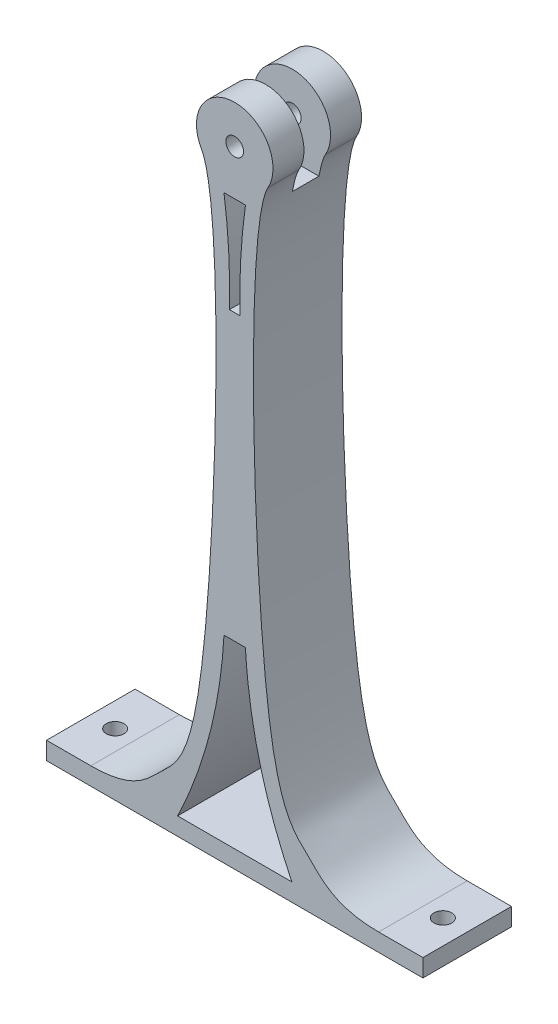
ISO-10303-21;
HEADER;
FILE_DESCRIPTION(('STEP AP214'),'2;1');
FILE_NAME('part.step','',(''),(''),'','','');
FILE_SCHEMA(('AUTOMOTIVE_DESIGN { 1 0 10303 214 1 1 1 1 }'));
ENDSEC;
DATA;
#1=APPLICATION_CONTEXT('core data for automotive mechanical design processes');
#2=APPLICATION_PROTOCOL_DEFINITION('international standard','automotive_design',2000,#1);
#3=PRODUCT_CONTEXT('',#1,'mechanical');
#4=PRODUCT('Part','Part','',(#3));
#5=PRODUCT_RELATED_PRODUCT_CATEGORY('part','',(#4));
#6=PRODUCT_DEFINITION_FORMATION('','',#4);
#7=PRODUCT_DEFINITION_CONTEXT('part definition',#1,'design');
#8=PRODUCT_DEFINITION('design','',#6,#7);
#9=PRODUCT_DEFINITION_SHAPE('','',#8);
#10=(LENGTH_UNIT() NAMED_UNIT(*) SI_UNIT(.MILLI.,.METRE.));
#11=(NAMED_UNIT(*) PLANE_ANGLE_UNIT() SI_UNIT($,.RADIAN.));
#12=(NAMED_UNIT(*) SI_UNIT($,.STERADIAN.) SOLID_ANGLE_UNIT());
#13=UNCERTAINTY_MEASURE_WITH_UNIT(LENGTH_MEASURE(1.E-05),#10,'distance_accuracy_value','');
#14=(GEOMETRIC_REPRESENTATION_CONTEXT(3) GLOBAL_UNCERTAINTY_ASSIGNED_CONTEXT((#13)) GLOBAL_UNIT_ASSIGNED_CONTEXT((#10,
#11,#12)) REPRESENTATION_CONTEXT('',''));
#15=CARTESIAN_POINT('',(0.,0.,0.));
#16=DIRECTION('',(0.,0.,1.));
#17=DIRECTION('',(1.,0.,0.));
#18=AXIS2_PLACEMENT_3D('',#15,#16,#17);
#19=CARTESIAN_POINT('',(0.,141.357798755725,20.));
#20=DIRECTION('',(0.,0.,-1.));
#21=DIRECTION('',(-1.,0.,0.));
#22=AXIS2_PLACEMENT_3D('',#19,#20,#21);
#23=CYLINDRICAL_SURFACE('',#22,8.64220124427539);
#24=CARTESIAN_POINT('',(0.,141.357798755725,7.));
#25=DIRECTION('',(0.,0.,1.));
#26=DIRECTION('',(1.,0.,0.));
#27=AXIS2_PLACEMENT_3D('',#24,#25,#26);
#28=CIRCLE('',#27,8.64220124427539);
#29=CARTESIAN_POINT('',(7.50000000000002,137.063891170953,7.));
#30=VERTEX_POINT('',#29);
#31=CARTESIAN_POINT('',(-7.50000000000002,137.063891170953,7.));
#32=VERTEX_POINT('',#31);
#33=EDGE_CURVE('E213',#30,#32,#28,.T.);
#34=ORIENTED_EDGE('',*,*,#33,.F.);
#35=DIRECTION('',(0.,0.,-1.));
#36=VECTOR('',#35,1.);
#37=CARTESIAN_POINT('',(7.5,137.063891170953,20.));
#38=LINE('',#37,#36);
#39=CARTESIAN_POINT('',(7.5,137.063891170953,0.));
#40=VERTEX_POINT('',#39);
#41=EDGE_CURVE('E198',#30,#40,#38,.T.);
#42=ORIENTED_EDGE('',*,*,#41,.T.);
#43=CARTESIAN_POINT('',(0.,141.357798755725,0.));
#44=DIRECTION('',(0.,0.,1.));
#45=DIRECTION('',(-1.,0.,0.));
#46=AXIS2_PLACEMENT_3D('',#43,#44,#45);
#47=CIRCLE('',#46,8.64220124427539);
#48=CARTESIAN_POINT('',(-7.5,137.063891170953,0.));
#49=VERTEX_POINT('',#48);
#50=EDGE_CURVE('E389',#40,#49,#47,.T.);
#51=ORIENTED_EDGE('',*,*,#50,.T.);
#52=DIRECTION('',(0.,0.,-1.));
#53=VECTOR('',#52,1.);
#54=CARTESIAN_POINT('',(-7.5,137.063891170953,20.));
#55=LINE('',#54,#53);
#56=EDGE_CURVE('E411',#32,#49,#55,.T.);
#57=ORIENTED_EDGE('',*,*,#56,.F.);
#58=EDGE_LOOP('',(#34,#42,#51,#57));
#59=FACE_BOUND('',#58,.T.);
#60=ADVANCED_FACE('F33',(#59),#23,.T.);
#61=CARTESIAN_POINT('',(0.,141.357798755725,0.));
#62=DIRECTION('',(0.,0.,1.));
#63=DIRECTION('',(1.,0.,0.));
#64=AXIS2_PLACEMENT_3D('',#61,#62,#63);
#65=CYLINDRICAL_SURFACE('',#64,2.);
#66=CARTESIAN_POINT('',(0.,141.357798755725,0.));
#67=DIRECTION('',(0.,0.,1.));
#68=DIRECTION('',(1.,0.,0.));
#69=AXIS2_PLACEMENT_3D('',#66,#67,#68);
#70=CIRCLE('',#69,2.);
#71=CARTESIAN_POINT('',(2.,141.357798755725,0.));
#72=VERTEX_POINT('',#71);
#73=EDGE_CURVE('E223',#72,#72,#70,.T.);
#74=ORIENTED_EDGE('',*,*,#73,.F.);
#75=EDGE_LOOP('',(#74));
#76=FACE_BOUND('',#75,.T.);
#77=CARTESIAN_POINT('',(0.,141.357798755725,7.));
#78=DIRECTION('',(0.,0.,1.));
#79=DIRECTION('',(1.,0.,0.));
#80=AXIS2_PLACEMENT_3D('',#77,#78,#79);
#81=CIRCLE('',#80,2.);
#82=CARTESIAN_POINT('',(2.,141.357798755725,7.));
#83=VERTEX_POINT('',#82);
#84=EDGE_CURVE('E192',#83,#83,#81,.F.);
#85=ORIENTED_EDGE('',*,*,#84,.F.);
#86=EDGE_LOOP('',(#85));
#87=FACE_BOUND('',#86,.T.);
#88=ADVANCED_FACE('F252',(#76,#87),#65,.F.);
#89=CARTESIAN_POINT('',(-42.5,0.,20.));
#90=DIRECTION('',(0.,1.,0.));
#91=DIRECTION('',(0.,0.,1.));
#92=AXIS2_PLACEMENT_3D('',#89,#90,#91);
#93=PLANE('',#92);
#94=CARTESIAN_POINT('',(37.,0.,10.));
#95=DIRECTION('',(0.,1.,0.));
#96=DIRECTION('',(0.,0.,-1.));
#97=AXIS2_PLACEMENT_3D('',#94,#95,#96);
#98=CIRCLE('',#97,2.);
#99=CARTESIAN_POINT('',(37.,0.,8.00000000000001));
#100=VERTEX_POINT('',#99);
#101=EDGE_CURVE('E465',#100,#100,#98,.T.);
#102=ORIENTED_EDGE('',*,*,#101,.T.);
#103=EDGE_LOOP('',(#102));
#104=FACE_BOUND('',#103,.T.);
#105=CARTESIAN_POINT('',(-37.,0.,10.));
#106=DIRECTION('',(0.,1.,0.));
#107=DIRECTION('',(0.,0.,1.));
#108=AXIS2_PLACEMENT_3D('',#105,#106,#107);
#109=CIRCLE('',#108,2.);
#110=CARTESIAN_POINT('',(-37.,0.,12.));
#111=VERTEX_POINT('',#110);
#112=EDGE_CURVE('E461',#111,#111,#109,.T.);
#113=ORIENTED_EDGE('',*,*,#112,.T.);
#114=EDGE_LOOP('',(#113));
#115=FACE_BOUND('',#114,.T.);
#116=DIRECTION('',(1.,0.,0.));
#117=VECTOR('',#116,1.);
#118=CARTESIAN_POINT('',(-42.5,0.,0.));
#119=LINE('',#118,#117);
#120=CARTESIAN_POINT('',(-42.5,0.,0.));
#121=VERTEX_POINT('',#120);
#122=CARTESIAN_POINT('',(42.5,0.,0.));
#123=VERTEX_POINT('',#122);
#124=EDGE_CURVE('E305',#121,#123,#119,.T.);
#125=ORIENTED_EDGE('',*,*,#124,.T.);
#126=DIRECTION('',(0.,0.,-1.));
#127=VECTOR('',#126,1.);
#128=CARTESIAN_POINT('',(42.5,0.,20.));
#129=LINE('',#128,#127);
#130=CARTESIAN_POINT('',(42.5,0.,20.));
#131=VERTEX_POINT('',#130);
#132=EDGE_CURVE('E41',#131,#123,#129,.T.);
#133=ORIENTED_EDGE('',*,*,#132,.F.);
#134=DIRECTION('',(1.,0.,0.));
#135=VECTOR('',#134,1.);
#136=CARTESIAN_POINT('',(-42.5,0.,20.));
#137=LINE('',#136,#135);
#138=CARTESIAN_POINT('',(-42.5,0.,20.));
#139=VERTEX_POINT('',#138);
#140=EDGE_CURVE('E312',#139,#131,#137,.T.);
#141=ORIENTED_EDGE('',*,*,#140,.F.);
#142=DIRECTION('',(0.,0.,-1.));
#143=VECTOR('',#142,1.);
#144=CARTESIAN_POINT('',(-42.5,0.,20.));
#145=LINE('',#144,#143);
#146=EDGE_CURVE('E377',#139,#121,#145,.T.);
#147=ORIENTED_EDGE('',*,*,#146,.T.);
#148=EDGE_LOOP('',(#125,#133,#141,#147));
#149=FACE_BOUND('',#148,.T.);
#150=ADVANCED_FACE('F35',(#104,#115,#149),#93,.F.);
#151=CARTESIAN_POINT('',(42.5,0.,20.));
#152=DIRECTION('',(-1.,0.,0.));
#153=DIRECTION('',(0.,0.,1.));
#154=AXIS2_PLACEMENT_3D('',#151,#152,#153);
#155=PLANE('',#154);
#156=DIRECTION('',(0.,1.,0.));
#157=VECTOR('',#156,1.);
#158=CARTESIAN_POINT('',(42.5,0.,0.));
#159=LINE('',#158,#157);
#160=CARTESIAN_POINT('',(42.5,4.,0.));
#161=VERTEX_POINT('',#160);
#162=EDGE_CURVE('E380',#123,#161,#159,.T.);
#163=ORIENTED_EDGE('',*,*,#162,.T.);
#164=DIRECTION('',(0.,0.,-1.));
#165=VECTOR('',#164,1.);
#166=CARTESIAN_POINT('',(42.5,4.,20.));
#167=LINE('',#166,#165);
#168=CARTESIAN_POINT('',(42.5,4.,20.));
#169=VERTEX_POINT('',#168);
#170=EDGE_CURVE('E201',#169,#161,#167,.T.);
#171=ORIENTED_EDGE('',*,*,#170,.F.);
#172=DIRECTION('',(0.,1.,0.));
#173=VECTOR('',#172,1.);
#174=CARTESIAN_POINT('',(42.5,0.,20.));
#175=LINE('',#174,#173);
#176=EDGE_CURVE('E315',#131,#169,#175,.T.);
#177=ORIENTED_EDGE('',*,*,#176,.F.);
#178=ORIENTED_EDGE('',*,*,#132,.T.);
#179=EDGE_LOOP('',(#163,#171,#177,#178));
#180=FACE_BOUND('',#179,.T.);
#181=ADVANCED_FACE('F336',(#180),#155,.F.);
#182=CARTESIAN_POINT('',(42.5,4.,20.));
#183=DIRECTION('',(0.,-1.,0.));
#184=DIRECTION('',(0.,0.,-1.));
#185=AXIS2_PLACEMENT_3D('',#182,#183,#184);
#186=PLANE('',#185);
#187=CARTESIAN_POINT('',(37.,4.,10.));
#188=DIRECTION('',(0.,1.,0.));
#189=DIRECTION('',(0.,0.,-1.));
#190=AXIS2_PLACEMENT_3D('',#187,#188,#189);
#191=CIRCLE('',#190,2.);
#192=CARTESIAN_POINT('',(37.,4.,8.00000000000001));
#193=VERTEX_POINT('',#192);
#194=EDGE_CURVE('E468',#193,#193,#191,.T.);
#195=ORIENTED_EDGE('',*,*,#194,.F.);
#196=EDGE_LOOP('',(#195));
#197=FACE_BOUND('',#196,.T.);
#198=DIRECTION('',(-1.,0.,0.));
#199=VECTOR('',#198,1.);
#200=CARTESIAN_POINT('',(42.5,4.,0.));
#201=LINE('',#200,#199);
#202=CARTESIAN_POINT('',(32.5,4.,0.));
#203=VERTEX_POINT('',#202);
#204=EDGE_CURVE('E382',#161,#203,#201,.T.);
#205=ORIENTED_EDGE('',*,*,#204,.T.);
#206=DIRECTION('',(0.,0.,-1.));
#207=VECTOR('',#206,1.);
#208=CARTESIAN_POINT('',(32.5,4.,20.));
#209=LINE('',#208,#207);
#210=CARTESIAN_POINT('',(32.5,4.,20.));
#211=VERTEX_POINT('',#210);
#212=EDGE_CURVE('E197',#211,#203,#209,.T.);
#213=ORIENTED_EDGE('',*,*,#212,.F.);
#214=DIRECTION('',(-1.,0.,0.));
#215=VECTOR('',#214,1.);
#216=CARTESIAN_POINT('',(42.5,4.,20.));
#217=LINE('',#216,#215);
#218=EDGE_CURVE('E318',#169,#211,#217,.T.);
#219=ORIENTED_EDGE('',*,*,#218,.F.);
#220=ORIENTED_EDGE('',*,*,#170,.T.);
#221=EDGE_LOOP('',(#205,#213,#219,#220));
#222=FACE_BOUND('',#221,.T.);
#223=ADVANCED_FACE('F333',(#197,#222),#186,.F.);
#224=CARTESIAN_POINT('',(32.5,4.,20.));
#225=CARTESIAN_POINT('',(22.6706393581156,4.,20.));
#226=CARTESIAN_POINT('',(16.2269901239387,12.3012186749502,20.));
#227=CARTESIAN_POINT('',(5.12239003175492,19.1144344698715,20.));
#228=CARTESIAN_POINT('',(2.36428260772779,128.093534990338,20.));
#229=CARTESIAN_POINT('',(7.5,137.063891170953,20.));
#230=B_SPLINE_CURVE_WITH_KNOTS('',3,(#224,#225,#226,#227,#228,#229),.UNSPECIFIED.,.F.,.F.,(4,1,
1,4),(0.,0.229195189831371,0.488952723456587,0.855764583215691),.UNSPECIFIED.);
#231=DIRECTION('',(0.,0.,-1.));
#232=VECTOR('',#231,1.);
#233=SURFACE_OF_LINEAR_EXTRUSION('',#230,#232);
#234=ORIENTED_EDGE('',*,*,#41,.F.);
#235=CARTESIAN_POINT('',(32.5,4.,7.));
#236=CARTESIAN_POINT('',(22.6706393581156,4.,7.));
#237=CARTESIAN_POINT('',(16.2269901239387,12.3012186749502,7.));
#238=CARTESIAN_POINT('',(5.12239003175492,19.1144344698715,7.));
#239=CARTESIAN_POINT('',(2.36428260772779,128.093534990338,7.));
#240=CARTESIAN_POINT('',(7.5,137.063891170953,7.));
#241=B_SPLINE_CURVE_WITH_KNOTS('',3,(#235,#236,#237,#238,#239,#240),.UNSPECIFIED.,.F.,.F.,(4,1,
1,4),(0.,0.229195189831371,0.488952723456587,0.855764583215691),.UNSPECIFIED.);
#242=CARTESIAN_POINT('',(6.01245165977054,132.063891170953,7.));
#243=VERTEX_POINT('',#242);
#244=EDGE_CURVE('E430',#30,#243,#241,.F.);
#245=ORIENTED_EDGE('',*,*,#244,.T.);
#246=DIRECTION('',(0.,0.,-1.));
#247=VECTOR('',#246,1.);
#248=CARTESIAN_POINT('',(6.01245165977054,132.063891170953,20.));
#249=LINE('',#248,#247);
#250=CARTESIAN_POINT('',(6.01245165977054,132.063891170953,13.));
#251=VERTEX_POINT('',#250);
#252=EDGE_CURVE('E178',#251,#243,#249,.T.);
#253=ORIENTED_EDGE('',*,*,#252,.F.);
#254=CARTESIAN_POINT('',(32.5,4.,13.));
#255=CARTESIAN_POINT('',(22.6706393581156,4.,13.));
#256=CARTESIAN_POINT('',(16.2269901239387,12.3012186749502,13.));
#257=CARTESIAN_POINT('',(5.12239003175492,19.1144344698715,13.));
#258=CARTESIAN_POINT('',(2.36428260772779,128.093534990338,13.));
#259=CARTESIAN_POINT('',(7.5,137.063891170953,13.));
#260=B_SPLINE_CURVE_WITH_KNOTS('',3,(#254,#255,#256,#257,#258,#259),.UNSPECIFIED.,.F.,.F.,(4,1,
1,4),(0.,0.229195189831371,0.488952723456587,0.855764583215691),.UNSPECIFIED.);
#261=CARTESIAN_POINT('',(7.50000000000001,137.063891170953,13.));
#262=VERTEX_POINT('',#261);
#263=EDGE_CURVE('E169',#251,#262,#260,.T.);
#264=ORIENTED_EDGE('',*,*,#263,.T.);
#265=CARTESIAN_POINT('',(7.5,137.063891170953,20.));
#266=VERTEX_POINT('',#265);
#267=EDGE_CURVE('E175',#266,#262,#38,.T.);
#268=ORIENTED_EDGE('',*,*,#267,.F.);
#269=EDGE_CURVE('E320',#211,#266,#230,.T.);
#270=ORIENTED_EDGE('',*,*,#269,.F.);
#271=ORIENTED_EDGE('',*,*,#212,.T.);
#272=CARTESIAN_POINT('',(32.5,4.,0.));
#273=CARTESIAN_POINT('',(22.6706393581156,4.,0.));
#274=CARTESIAN_POINT('',(16.2269901239387,12.3012186749502,0.));
#275=CARTESIAN_POINT('',(5.12239003175492,19.1144344698715,0.));
#276=CARTESIAN_POINT('',(2.36428260772779,128.093534990338,0.));
#277=CARTESIAN_POINT('',(7.5,137.063891170953,0.));
#278=B_SPLINE_CURVE_WITH_KNOTS('',3,(#272,#273,#274,#275,#276,#277),.UNSPECIFIED.,.F.,.F.,(4,1,
1,4),(0.,0.229195189831371,0.488952723456587,0.855764583215691),.UNSPECIFIED.);
#279=EDGE_CURVE('E384',#203,#40,#278,.T.);
#280=ORIENTED_EDGE('',*,*,#279,.T.);
#281=EDGE_LOOP('',(#234,#245,#253,#264,#268,#270,#271,#280));
#282=FACE_BOUND('',#281,.T.);
#283=ADVANCED_FACE('F172',(#282),#233,.F.);
#284=ORIENTED_EDGE('',*,*,#267,.T.);
#285=CARTESIAN_POINT('',(0.,141.357798755725,13.));
#286=DIRECTION('',(0.,0.,1.));
#287=DIRECTION('',(1.,0.,0.));
#288=AXIS2_PLACEMENT_3D('',#285,#286,#287);
#289=CIRCLE('',#288,8.64220124427539);
#290=CARTESIAN_POINT('',(-7.5,137.063891170953,13.));
#291=VERTEX_POINT('',#290);
#292=EDGE_CURVE('E186',#262,#291,#289,.T.);
#293=ORIENTED_EDGE('',*,*,#292,.T.);
#294=CARTESIAN_POINT('',(-7.5,137.063891170953,20.));
#295=VERTEX_POINT('',#294);
#296=EDGE_CURVE('E203',#295,#291,#55,.T.);
#297=ORIENTED_EDGE('',*,*,#296,.F.);
#298=CARTESIAN_POINT('',(0.,141.357798755725,20.));
#299=DIRECTION('',(0.,0.,1.));
#300=DIRECTION('',(-1.,0.,0.));
#301=AXIS2_PLACEMENT_3D('',#298,#299,#300);
#302=CIRCLE('',#301,8.64220124427539);
#303=EDGE_CURVE('E196',#266,#295,#302,.T.);
#304=ORIENTED_EDGE('',*,*,#303,.F.);
#305=EDGE_LOOP('',(#284,#293,#297,#304));
#306=FACE_BOUND('',#305,.T.);
#307=ADVANCED_FACE('F195',(#306),#23,.T.);
#308=CARTESIAN_POINT('',(-7.5,137.063891170953,20.));
#309=CARTESIAN_POINT('',(-2.36428260772779,128.093534990338,20.));
#310=CARTESIAN_POINT('',(-5.12239003175493,19.1144344698715,20.));
#311=CARTESIAN_POINT('',(-16.2269901239387,12.3012186749502,20.));
#312=CARTESIAN_POINT('',(-22.6706393581156,4.,20.));
#313=CARTESIAN_POINT('',(-32.5,4.,20.));
#314=B_SPLINE_CURVE_WITH_KNOTS('',3,(#308,#309,#310,#311,#312,#313),.UNSPECIFIED.,.F.,.F.,(4,1,
1,4),(0.,0.366811859759105,0.626569393384321,0.855764583215691),.UNSPECIFIED.);
#315=DIRECTION('',(0.,0.,-1.));
#316=VECTOR('',#315,1.);
#317=SURFACE_OF_LINEAR_EXTRUSION('',#314,#316);
#318=DIRECTION('',(0.,0.,-1.));
#319=VECTOR('',#318,1.);
#320=CARTESIAN_POINT('',(-6.01245165977054,132.063891170953,20.));
#321=LINE('',#320,#319);
#322=CARTESIAN_POINT('',(-6.01245165977054,132.063891170953,7.));
#323=VERTEX_POINT('',#322);
#324=CARTESIAN_POINT('',(-6.01245165977054,132.063891170953,13.));
#325=VERTEX_POINT('',#324);
#326=EDGE_CURVE('E11',#323,#325,#321,.F.);
#327=ORIENTED_EDGE('',*,*,#326,.F.);
#328=CARTESIAN_POINT('',(-7.5,137.063891170953,7.));
#329=CARTESIAN_POINT('',(-2.36428260772779,128.093534990338,7.));
#330=CARTESIAN_POINT('',(-5.12239003175493,19.1144344698715,7.));
#331=CARTESIAN_POINT('',(-16.2269901239387,12.3012186749502,7.));
#332=CARTESIAN_POINT('',(-22.6706393581156,4.,7.));
#333=CARTESIAN_POINT('',(-32.5,4.,7.));
#334=B_SPLINE_CURVE_WITH_KNOTS('',3,(#328,#329,#330,#331,#332,#333),.UNSPECIFIED.,.F.,.F.,(4,1,
1,4),(0.,0.366811859759105,0.626569393384321,0.855764583215691),.UNSPECIFIED.);
#335=EDGE_CURVE('E182',#323,#32,#334,.F.);
#336=ORIENTED_EDGE('',*,*,#335,.T.);
#337=ORIENTED_EDGE('',*,*,#56,.T.);
#338=CARTESIAN_POINT('',(-7.5,137.063891170953,0.));
#339=CARTESIAN_POINT('',(-2.36428260772779,128.093534990338,0.));
#340=CARTESIAN_POINT('',(-5.12239003175493,19.1144344698715,0.));
#341=CARTESIAN_POINT('',(-16.2269901239387,12.3012186749502,0.));
#342=CARTESIAN_POINT('',(-22.6706393581156,4.,0.));
#343=CARTESIAN_POINT('',(-32.5,4.,0.));
#344=B_SPLINE_CURVE_WITH_KNOTS('',3,(#338,#339,#340,#341,#342,#343),.UNSPECIFIED.,.F.,.F.,(4,1,
1,4),(0.,0.366811859759105,0.626569393384321,0.855764583215691),.UNSPECIFIED.);
#345=CARTESIAN_POINT('',(-32.5,4.,0.));
#346=VERTEX_POINT('',#345);
#347=EDGE_CURVE('E395',#49,#346,#344,.T.);
#348=ORIENTED_EDGE('',*,*,#347,.T.);
#349=DIRECTION('',(0.,0.,-1.));
#350=VECTOR('',#349,1.);
#351=CARTESIAN_POINT('',(-32.5,4.,20.));
#352=LINE('',#351,#350);
#353=CARTESIAN_POINT('',(-32.5,4.,20.));
#354=VERTEX_POINT('',#353);
#355=EDGE_CURVE('E409',#354,#346,#352,.T.);
#356=ORIENTED_EDGE('',*,*,#355,.F.);
#357=EDGE_CURVE('E365',#295,#354,#314,.T.);
#358=ORIENTED_EDGE('',*,*,#357,.F.);
#359=ORIENTED_EDGE('',*,*,#296,.T.);
#360=CARTESIAN_POINT('',(-7.5,137.063891170953,13.));
#361=CARTESIAN_POINT('',(-2.36428260772779,128.093534990338,13.));
#362=CARTESIAN_POINT('',(-5.12239003175493,19.1144344698715,13.));
#363=CARTESIAN_POINT('',(-16.2269901239387,12.3012186749502,13.));
#364=CARTESIAN_POINT('',(-22.6706393581156,4.,13.));
#365=CARTESIAN_POINT('',(-32.5,4.,13.));
#366=B_SPLINE_CURVE_WITH_KNOTS('',3,(#360,#361,#362,#363,#364,#365),.UNSPECIFIED.,.F.,.F.,(4,1,
1,4),(0.,0.366811859759105,0.626569393384321,0.855764583215691),.UNSPECIFIED.);
#367=EDGE_CURVE('E183',#291,#325,#366,.T.);
#368=ORIENTED_EDGE('',*,*,#367,.T.);
#369=EDGE_LOOP('',(#327,#336,#337,#348,#356,#358,#359,#368));
#370=FACE_BOUND('',#369,.T.);
#371=ADVANCED_FACE('F351',(#370),#317,.F.);
#372=CARTESIAN_POINT('',(-42.5,4.,20.));
#373=DIRECTION('',(0.,-1.,0.));
#374=DIRECTION('',(0.,0.,-1.));
#375=AXIS2_PLACEMENT_3D('',#372,#373,#374);
#376=PLANE('',#375);
#377=CARTESIAN_POINT('',(-37.,4.,10.));
#378=DIRECTION('',(0.,1.,0.));
#379=DIRECTION('',(0.,0.,1.));
#380=AXIS2_PLACEMENT_3D('',#377,#378,#379);
#381=CIRCLE('',#380,2.);
#382=CARTESIAN_POINT('',(-37.,4.,12.));
#383=VERTEX_POINT('',#382);
#384=EDGE_CURVE('E462',#383,#383,#381,.T.);
#385=ORIENTED_EDGE('',*,*,#384,.F.);
#386=EDGE_LOOP('',(#385));
#387=FACE_BOUND('',#386,.T.);
#388=DIRECTION('',(-1.,0.,0.));
#389=VECTOR('',#388,1.);
#390=CARTESIAN_POINT('',(-42.5,4.,0.));
#391=LINE('',#390,#389);
#392=CARTESIAN_POINT('',(-42.5,4.,0.));
#393=VERTEX_POINT('',#392);
#394=EDGE_CURVE('E399',#346,#393,#391,.T.);
#395=ORIENTED_EDGE('',*,*,#394,.T.);
#396=DIRECTION('',(0.,0.,-1.));
#397=VECTOR('',#396,1.);
#398=CARTESIAN_POINT('',(-42.5,4.,20.));
#399=LINE('',#398,#397);
#400=CARTESIAN_POINT('',(-42.5,4.,20.));
#401=VERTEX_POINT('',#400);
#402=EDGE_CURVE('E407',#401,#393,#399,.T.);
#403=ORIENTED_EDGE('',*,*,#402,.F.);
#404=DIRECTION('',(-1.,0.,0.));
#405=VECTOR('',#404,1.);
#406=CARTESIAN_POINT('',(-42.5,4.,20.));
#407=LINE('',#406,#405);
#408=EDGE_CURVE('E370',#354,#401,#407,.T.);
#409=ORIENTED_EDGE('',*,*,#408,.F.);
#410=ORIENTED_EDGE('',*,*,#355,.T.);
#411=EDGE_LOOP('',(#395,#403,#409,#410));
#412=FACE_BOUND('',#411,.T.);
#413=ADVANCED_FACE('F355',(#387,#412),#376,.F.);
#414=CARTESIAN_POINT('',(-42.5,0.,20.));
#415=DIRECTION('',(1.,0.,0.));
#416=DIRECTION('',(0.,0.,-1.));
#417=AXIS2_PLACEMENT_3D('',#414,#415,#416);
#418=PLANE('',#417);
#419=DIRECTION('',(0.,-1.,0.));
#420=VECTOR('',#419,1.);
#421=CARTESIAN_POINT('',(-42.5,0.,0.));
#422=LINE('',#421,#420);
#423=EDGE_CURVE('E316',#393,#121,#422,.T.);
#424=ORIENTED_EDGE('',*,*,#423,.T.);
#425=ORIENTED_EDGE('',*,*,#146,.F.);
#426=DIRECTION('',(0.,-1.,0.));
#427=VECTOR('',#426,1.);
#428=CARTESIAN_POINT('',(-42.5,0.,20.));
#429=LINE('',#428,#427);
#430=EDGE_CURVE('E375',#401,#139,#429,.T.);
#431=ORIENTED_EDGE('',*,*,#430,.F.);
#432=ORIENTED_EDGE('',*,*,#402,.T.);
#433=EDGE_LOOP('',(#424,#425,#431,#432));
#434=FACE_BOUND('',#433,.T.);
#435=ADVANCED_FACE('F360',(#434),#418,.F.);
#436=CARTESIAN_POINT('',(9.30251710474295,24.7855831753184,20.));
#437=DIRECTION('',(0.,0.,1.));
#438=DIRECTION('',(1.,0.,0.));
#439=AXIS2_PLACEMENT_3D('',#436,#437,#438);
#440=PLANE('',#439);
#441=CARTESIAN_POINT('',(-2.42164223609018,44.5913892952839,20.));
#442=CARTESIAN_POINT('',(-3.60341910041158,23.1883965348915,20.));
#443=CARTESIAN_POINT('',(-12.8961504657244,4.,20.));
#444=B_SPLINE_CURVE_WITH_KNOTS('',2,(#441,#442,#443),.UNSPECIFIED.,.F.,.F.,(3,3),(0.,1.),.UNSPECIFIED.);
#445=CARTESIAN_POINT('',(-2.42164223609018,44.5913892952839,20.));
#446=VERTEX_POINT('',#445);
#447=CARTESIAN_POINT('',(-12.8961504657244,4.,20.));
#448=VERTEX_POINT('',#447);
#449=EDGE_CURVE('E48',#446,#448,#444,.T.);
#450=ORIENTED_EDGE('',*,*,#449,.F.);
#451=DIRECTION('',(-1.,0.,0.));
#452=VECTOR('',#451,1.);
#453=CARTESIAN_POINT('',(-2.42164223609018,44.5913892952839,20.));
#454=LINE('',#453,#452);
#455=CARTESIAN_POINT('',(2.42164223609018,44.5913892952839,20.));
#456=VERTEX_POINT('',#455);
#457=EDGE_CURVE('E234',#456,#446,#454,.T.);
#458=ORIENTED_EDGE('',*,*,#457,.F.);
#459=CARTESIAN_POINT('',(12.8961504657244,4.,20.));
#460=CARTESIAN_POINT('',(3.60341910041158,23.1883965348915,20.));
#461=CARTESIAN_POINT('',(2.42164223609018,44.5913892952839,20.));
#462=B_SPLINE_CURVE_WITH_KNOTS('',2,(#459,#460,#461),.UNSPECIFIED.,.F.,.F.,(3,3),(0.,1.),.UNSPECIFIED.);
#463=CARTESIAN_POINT('',(12.8961504657244,4.,20.));
#464=VERTEX_POINT('',#463);
#465=EDGE_CURVE('E520',#464,#456,#462,.T.);
#466=ORIENTED_EDGE('',*,*,#465,.F.);
#467=DIRECTION('',(1.,0.,0.));
#468=VECTOR('',#467,1.);
#469=CARTESIAN_POINT('',(-12.8961504657244,4.,20.));
#470=LINE('',#469,#468);
#471=EDGE_CURVE('E525',#448,#464,#470,.T.);
#472=ORIENTED_EDGE('',*,*,#471,.F.);
#473=EDGE_LOOP('',(#450,#458,#466,#472));
#474=FACE_BOUND('',#473,.T.);
#475=CARTESIAN_POINT('',(0.,141.357798755725,20.));
#476=DIRECTION('',(0.,0.,1.));
#477=DIRECTION('',(1.,0.,0.));
#478=AXIS2_PLACEMENT_3D('',#475,#476,#477);
#479=CIRCLE('',#478,2.);
#480=CARTESIAN_POINT('',(2.,141.357798755725,20.));
#481=VERTEX_POINT('',#480);
#482=EDGE_CURVE('E217',#481,#481,#479,.T.);
#483=ORIENTED_EDGE('',*,*,#482,.F.);
#484=EDGE_LOOP('',(#483));
#485=FACE_BOUND('',#484,.T.);
#486=CARTESIAN_POINT('',(-2.42164223609018,131.12685385204,20.));
#487=CARTESIAN_POINT('',(-0.876872728756463,120.033282633974,20.));
#488=CARTESIAN_POINT('',(-1.21082111804509,108.860493989931,20.));
#489=B_SPLINE_CURVE_WITH_KNOTS('',2,(#486,#487,#488),.UNSPECIFIED.,.F.,.F.,(3,3),(0.,1.),.UNSPECIFIED.);
#490=CARTESIAN_POINT('',(-2.42164223609018,131.12685385204,20.));
#491=VERTEX_POINT('',#490);
#492=CARTESIAN_POINT('',(-1.21082111804509,108.860493989931,20.));
#493=VERTEX_POINT('',#492);
#494=EDGE_CURVE('E280',#491,#493,#489,.T.);
#495=ORIENTED_EDGE('',*,*,#494,.F.);
#496=DIRECTION('',(-1.,0.,0.));
#497=VECTOR('',#496,1.);
#498=CARTESIAN_POINT('',(-2.42164223609018,131.12685385204,20.));
#499=LINE('',#498,#497);
#500=CARTESIAN_POINT('',(2.42164223609018,131.12685385204,20.));
#501=VERTEX_POINT('',#500);
#502=EDGE_CURVE('E296',#501,#491,#499,.T.);
#503=ORIENTED_EDGE('',*,*,#502,.F.);
#504=CARTESIAN_POINT('',(1.21082111804509,108.860493989931,20.));
#505=CARTESIAN_POINT('',(0.876872728756463,120.033282633974,20.));
#506=CARTESIAN_POINT('',(2.42164223609018,131.12685385204,20.));
#507=B_SPLINE_CURVE_WITH_KNOTS('',2,(#504,#505,#506),.UNSPECIFIED.,.F.,.F.,(3,3),(0.,1.),.UNSPECIFIED.);
#508=CARTESIAN_POINT('',(1.21082111804509,108.860493989931,20.));
#509=VERTEX_POINT('',#508);
#510=EDGE_CURVE('E291',#509,#501,#507,.T.);
#511=ORIENTED_EDGE('',*,*,#510,.F.);
#512=DIRECTION('',(1.,0.,0.));
#513=VECTOR('',#512,1.);
#514=CARTESIAN_POINT('',(-1.21082111804509,108.860493989931,20.));
#515=LINE('',#514,#513);
#516=EDGE_CURVE('E284',#493,#509,#515,.T.);
#517=ORIENTED_EDGE('',*,*,#516,.F.);
#518=EDGE_LOOP('',(#495,#503,#511,#517));
#519=FACE_BOUND('',#518,.T.);
#520=ORIENTED_EDGE('',*,*,#140,.T.);
#521=ORIENTED_EDGE('',*,*,#176,.T.);
#522=ORIENTED_EDGE('',*,*,#218,.T.);
#523=ORIENTED_EDGE('',*,*,#269,.T.);
#524=ORIENTED_EDGE('',*,*,#303,.T.);
#525=ORIENTED_EDGE('',*,*,#357,.T.);
#526=ORIENTED_EDGE('',*,*,#408,.T.);
#527=ORIENTED_EDGE('',*,*,#430,.T.);
#528=EDGE_LOOP('',(#520,#521,#522,#523,#524,#525,#526,#527));
#529=FACE_BOUND('',#528,.T.);
#530=ADVANCED_FACE('F418',(#474,#485,#519,#529),#440,.T.);
#531=CARTESIAN_POINT('',(9.30251710474295,24.7855831753184,0.));
#532=DIRECTION('',(0.,0.,1.));
#533=DIRECTION('',(1.,0.,0.));
#534=AXIS2_PLACEMENT_3D('',#531,#532,#533);
#535=PLANE('',#534);
#536=DIRECTION('',(-1.,0.,0.));
#537=VECTOR('',#536,1.);
#538=CARTESIAN_POINT('',(-2.42164223609018,44.5913892952839,0.));
#539=LINE('',#538,#537);
#540=CARTESIAN_POINT('',(2.42164223609018,44.5913892952839,0.));
#541=VERTEX_POINT('',#540);
#542=CARTESIAN_POINT('',(-2.42164223609018,44.5913892952839,0.));
#543=VERTEX_POINT('',#542);
#544=EDGE_CURVE('E513',#541,#543,#539,.T.);
#545=ORIENTED_EDGE('',*,*,#544,.T.);
#546=CARTESIAN_POINT('',(-2.42164223609018,44.5913892952839,0.));
#547=CARTESIAN_POINT('',(-3.60341910041158,23.1883965348915,0.));
#548=CARTESIAN_POINT('',(-12.8961504657244,4.,0.));
#549=B_SPLINE_CURVE_WITH_KNOTS('',2,(#546,#547,#548),.UNSPECIFIED.,.F.,.F.,(3,3),(0.,1.),.UNSPECIFIED.);
#550=CARTESIAN_POINT('',(-12.8961504657244,4.,0.));
#551=VERTEX_POINT('',#550);
#552=EDGE_CURVE('E227',#543,#551,#549,.T.);
#553=ORIENTED_EDGE('',*,*,#552,.T.);
#554=DIRECTION('',(1.,0.,0.));
#555=VECTOR('',#554,1.);
#556=CARTESIAN_POINT('',(-12.8961504657244,4.,0.));
#557=LINE('',#556,#555);
#558=CARTESIAN_POINT('',(12.8961504657244,4.,0.));
#559=VERTEX_POINT('',#558);
#560=EDGE_CURVE('E233',#551,#559,#557,.T.);
#561=ORIENTED_EDGE('',*,*,#560,.T.);
#562=CARTESIAN_POINT('',(12.8961504657244,4.,0.));
#563=CARTESIAN_POINT('',(3.60341910041158,23.1883965348915,0.));
#564=CARTESIAN_POINT('',(2.42164223609018,44.5913892952839,0.));
#565=B_SPLINE_CURVE_WITH_KNOTS('',2,(#562,#563,#564),.UNSPECIFIED.,.F.,.F.,(3,3),(0.,1.),.UNSPECIFIED.);
#566=EDGE_CURVE('E56',#559,#541,#565,.T.);
#567=ORIENTED_EDGE('',*,*,#566,.T.);
#568=EDGE_LOOP('',(#545,#553,#561,#567));
#569=FACE_BOUND('',#568,.T.);
#570=ORIENTED_EDGE('',*,*,#73,.T.);
#571=EDGE_LOOP('',(#570));
#572=FACE_BOUND('',#571,.T.);
#573=DIRECTION('',(-1.,0.,0.));
#574=VECTOR('',#573,1.);
#575=CARTESIAN_POINT('',(-2.42164223609018,131.12685385204,0.));
#576=LINE('',#575,#574);
#577=CARTESIAN_POINT('',(2.42164223609018,131.12685385204,0.));
#578=VERTEX_POINT('',#577);
#579=CARTESIAN_POINT('',(-2.42164223609018,131.12685385204,0.));
#580=VERTEX_POINT('',#579);
#581=EDGE_CURVE('E271',#578,#580,#576,.T.);
#582=ORIENTED_EDGE('',*,*,#581,.T.);
#583=CARTESIAN_POINT('',(-2.42164223609018,131.12685385204,0.));
#584=CARTESIAN_POINT('',(-0.876872728756463,120.033282633974,0.));
#585=CARTESIAN_POINT('',(-1.21082111804509,108.860493989931,0.));
#586=B_SPLINE_CURVE_WITH_KNOTS('',2,(#583,#584,#585),.UNSPECIFIED.,.F.,.F.,(3,3),(0.,1.),.UNSPECIFIED.);
#587=CARTESIAN_POINT('',(-1.21082111804509,108.860493989931,0.));
#588=VERTEX_POINT('',#587);
#589=EDGE_CURVE('E302',#580,#588,#586,.T.);
#590=ORIENTED_EDGE('',*,*,#589,.T.);
#591=DIRECTION('',(1.,0.,0.));
#592=VECTOR('',#591,1.);
#593=CARTESIAN_POINT('',(-1.21082111804509,108.860493989931,0.));
#594=LINE('',#593,#592);
#595=CARTESIAN_POINT('',(1.21082111804509,108.860493989931,0.));
#596=VERTEX_POINT('',#595);
#597=EDGE_CURVE('E272',#588,#596,#594,.T.);
#598=ORIENTED_EDGE('',*,*,#597,.T.);
#599=CARTESIAN_POINT('',(1.21082111804509,108.860493989931,0.));
#600=CARTESIAN_POINT('',(0.876872728756463,120.033282633974,0.));
#601=CARTESIAN_POINT('',(2.42164223609018,131.12685385204,0.));
#602=B_SPLINE_CURVE_WITH_KNOTS('',2,(#599,#600,#601),.UNSPECIFIED.,.F.,.F.,(3,3),(0.,1.),.UNSPECIFIED.);
#603=EDGE_CURVE('E264',#596,#578,#602,.T.);
#604=ORIENTED_EDGE('',*,*,#603,.T.);
#605=EDGE_LOOP('',(#582,#590,#598,#604));
#606=FACE_BOUND('',#605,.T.);
#607=ORIENTED_EDGE('',*,*,#124,.F.);
#608=ORIENTED_EDGE('',*,*,#423,.F.);
#609=ORIENTED_EDGE('',*,*,#394,.F.);
#610=ORIENTED_EDGE('',*,*,#347,.F.);
#611=ORIENTED_EDGE('',*,*,#50,.F.);
#612=ORIENTED_EDGE('',*,*,#279,.F.);
#613=ORIENTED_EDGE('',*,*,#204,.F.);
#614=ORIENTED_EDGE('',*,*,#162,.F.);
#615=EDGE_LOOP('',(#607,#608,#609,#610,#611,#612,#613,#614));
#616=FACE_BOUND('',#615,.T.);
#617=ADVANCED_FACE('F428',(#569,#572,#606,#616),#535,.F.);
#618=DIRECTION('',(0.,0.,1.));
#619=VECTOR('',#618,1.);
#620=SURFACE_OF_LINEAR_EXTRUSION('',#586,#619);
#621=ORIENTED_EDGE('',*,*,#494,.T.);
#622=DIRECTION('',(0.,0.,1.));
#623=VECTOR('',#622,1.);
#624=CARTESIAN_POINT('',(-1.21082111804509,108.860493989931,0.));
#625=LINE('',#624,#623);
#626=EDGE_CURVE('E279',#588,#493,#625,.T.);
#627=ORIENTED_EDGE('',*,*,#626,.F.);
#628=ORIENTED_EDGE('',*,*,#589,.F.);
#629=DIRECTION('',(0.,0.,1.));
#630=VECTOR('',#629,1.);
#631=CARTESIAN_POINT('',(-2.42164223609018,131.12685385204,0.));
#632=LINE('',#631,#630);
#633=EDGE_CURVE('E303',#580,#491,#632,.T.);
#634=ORIENTED_EDGE('',*,*,#633,.T.);
#635=EDGE_LOOP('',(#621,#627,#628,#634));
#636=FACE_BOUND('',#635,.T.);
#637=ADVANCED_FACE('F257',(#636),#620,.F.);
#638=CARTESIAN_POINT('',(-2.42164223609018,131.12685385204,0.));
#639=DIRECTION('',(0.,1.,0.));
#640=DIRECTION('',(0.,0.,1.));
#641=AXIS2_PLACEMENT_3D('',#638,#639,#640);
#642=PLANE('',#641);
#643=ORIENTED_EDGE('',*,*,#502,.T.);
#644=ORIENTED_EDGE('',*,*,#633,.F.);
#645=ORIENTED_EDGE('',*,*,#581,.F.);
#646=DIRECTION('',(0.,0.,1.));
#647=VECTOR('',#646,1.);
#648=CARTESIAN_POINT('',(2.42164223609018,131.12685385204,0.));
#649=LINE('',#648,#647);
#650=EDGE_CURVE('E306',#578,#501,#649,.T.);
#651=ORIENTED_EDGE('',*,*,#650,.T.);
#652=EDGE_LOOP('',(#643,#644,#645,#651));
#653=FACE_BOUND('',#652,.T.);
#654=ADVANCED_FACE('F253',(#653),#642,.F.);
#655=DIRECTION('',(0.,0.,1.));
#656=VECTOR('',#655,1.);
#657=SURFACE_OF_LINEAR_EXTRUSION('',#602,#656);
#658=ORIENTED_EDGE('',*,*,#510,.T.);
#659=ORIENTED_EDGE('',*,*,#650,.F.);
#660=ORIENTED_EDGE('',*,*,#603,.F.);
#661=DIRECTION('',(0.,0.,1.));
#662=VECTOR('',#661,1.);
#663=CARTESIAN_POINT('',(1.21082111804509,108.860493989931,0.));
#664=LINE('',#663,#662);
#665=EDGE_CURVE('E308',#596,#509,#664,.T.);
#666=ORIENTED_EDGE('',*,*,#665,.T.);
#667=EDGE_LOOP('',(#658,#659,#660,#666));
#668=FACE_BOUND('',#667,.T.);
#669=ADVANCED_FACE('F256',(#668),#657,.F.);
#670=CARTESIAN_POINT('',(-1.21082111804509,108.860493989931,0.));
#671=DIRECTION('',(0.,-1.,0.));
#672=DIRECTION('',(0.,0.,-1.));
#673=AXIS2_PLACEMENT_3D('',#670,#671,#672);
#674=PLANE('',#673);
#675=ORIENTED_EDGE('',*,*,#516,.T.);
#676=ORIENTED_EDGE('',*,*,#665,.F.);
#677=ORIENTED_EDGE('',*,*,#597,.F.);
#678=ORIENTED_EDGE('',*,*,#626,.T.);
#679=EDGE_LOOP('',(#675,#676,#677,#678));
#680=FACE_BOUND('',#679,.T.);
#681=ADVANCED_FACE('F250',(#680),#674,.F.);
#682=CARTESIAN_POINT('',(0.,141.357798755725,13.));
#683=DIRECTION('',(0.,0.,1.));
#684=DIRECTION('',(1.,0.,0.));
#685=AXIS2_PLACEMENT_3D('',#682,#683,#684);
#686=CIRCLE('',#685,2.);
#687=CARTESIAN_POINT('',(2.,141.357798755725,13.));
#688=VERTEX_POINT('',#687);
#689=EDGE_CURVE('E193',#688,#688,#686,.F.);
#690=ORIENTED_EDGE('',*,*,#689,.T.);
#691=EDGE_LOOP('',(#690));
#692=FACE_BOUND('',#691,.T.);
#693=ORIENTED_EDGE('',*,*,#482,.T.);
#694=EDGE_LOOP('',(#693));
#695=FACE_BOUND('',#694,.T.);
#696=ADVANCED_FACE('F245',(#692,#695),#65,.F.);
#697=DIRECTION('',(0.,0.,1.));
#698=VECTOR('',#697,1.);
#699=SURFACE_OF_LINEAR_EXTRUSION('',#549,#698);
#700=ORIENTED_EDGE('',*,*,#449,.T.);
#701=DIRECTION('',(0.,0.,1.));
#702=VECTOR('',#701,1.);
#703=CARTESIAN_POINT('',(-12.8961504657244,4.,0.));
#704=LINE('',#703,#702);
#705=EDGE_CURVE('E510',#551,#448,#704,.T.);
#706=ORIENTED_EDGE('',*,*,#705,.F.);
#707=ORIENTED_EDGE('',*,*,#552,.F.);
#708=DIRECTION('',(0.,0.,1.));
#709=VECTOR('',#708,1.);
#710=CARTESIAN_POINT('',(-2.42164223609018,44.5913892952839,0.));
#711=LINE('',#710,#709);
#712=EDGE_CURVE('E285',#543,#446,#711,.T.);
#713=ORIENTED_EDGE('',*,*,#712,.T.);
#714=EDGE_LOOP('',(#700,#706,#707,#713));
#715=FACE_BOUND('',#714,.T.);
#716=ADVANCED_FACE('F240',(#715),#699,.F.);
#717=CARTESIAN_POINT('',(-2.42164223609018,44.5913892952839,0.));
#718=DIRECTION('',(0.,1.,0.));
#719=DIRECTION('',(0.,0.,1.));
#720=AXIS2_PLACEMENT_3D('',#717,#718,#719);
#721=PLANE('',#720);
#722=ORIENTED_EDGE('',*,*,#457,.T.);
#723=ORIENTED_EDGE('',*,*,#712,.F.);
#724=ORIENTED_EDGE('',*,*,#544,.F.);
#725=DIRECTION('',(0.,0.,1.));
#726=VECTOR('',#725,1.);
#727=CARTESIAN_POINT('',(2.42164223609018,44.5913892952839,0.));
#728=LINE('',#727,#726);
#729=EDGE_CURVE('E515',#541,#456,#728,.T.);
#730=ORIENTED_EDGE('',*,*,#729,.T.);
#731=EDGE_LOOP('',(#722,#723,#724,#730));
#732=FACE_BOUND('',#731,.T.);
#733=ADVANCED_FACE('F244',(#732),#721,.F.);
#734=DIRECTION('',(0.,0.,1.));
#735=VECTOR('',#734,1.);
#736=SURFACE_OF_LINEAR_EXTRUSION('',#565,#735);
#737=ORIENTED_EDGE('',*,*,#465,.T.);
#738=ORIENTED_EDGE('',*,*,#729,.F.);
#739=ORIENTED_EDGE('',*,*,#566,.F.);
#740=DIRECTION('',(0.,0.,1.));
#741=VECTOR('',#740,1.);
#742=CARTESIAN_POINT('',(12.8961504657244,4.,0.));
#743=LINE('',#742,#741);
#744=EDGE_CURVE('E512',#559,#464,#743,.T.);
#745=ORIENTED_EDGE('',*,*,#744,.T.);
#746=EDGE_LOOP('',(#737,#738,#739,#745));
#747=FACE_BOUND('',#746,.T.);
#748=ADVANCED_FACE('F544',(#747),#736,.F.);
#749=CARTESIAN_POINT('',(-12.8961504657244,4.,0.));
#750=DIRECTION('',(0.,-1.,0.));
#751=DIRECTION('',(0.,0.,-1.));
#752=AXIS2_PLACEMENT_3D('',#749,#750,#751);
#753=PLANE('',#752);
#754=ORIENTED_EDGE('',*,*,#471,.T.);
#755=ORIENTED_EDGE('',*,*,#744,.F.);
#756=ORIENTED_EDGE('',*,*,#560,.F.);
#757=ORIENTED_EDGE('',*,*,#705,.T.);
#758=EDGE_LOOP('',(#754,#755,#756,#757));
#759=FACE_BOUND('',#758,.T.);
#760=ADVANCED_FACE('F246',(#759),#753,.F.);
#761=CARTESIAN_POINT('',(15.0000000000003,152.063891170953,7.));
#762=DIRECTION('',(0.,0.,1.));
#763=DIRECTION('',(1.,0.,0.));
#764=AXIS2_PLACEMENT_3D('',#761,#762,#763);
#765=PLANE('',#764);
#766=ORIENTED_EDGE('',*,*,#84,.T.);
#767=EDGE_LOOP('',(#766));
#768=FACE_BOUND('',#767,.T.);
#769=ORIENTED_EDGE('',*,*,#33,.T.);
#770=ORIENTED_EDGE('',*,*,#335,.F.);
#771=DIRECTION('',(-1.,0.,0.));
#772=VECTOR('',#771,1.);
#773=CARTESIAN_POINT('',(-8.6422012442754,132.063891170953,7.));
#774=LINE('',#773,#772);
#775=EDGE_CURVE('E453',#243,#323,#774,.T.);
#776=ORIENTED_EDGE('',*,*,#775,.F.);
#777=ORIENTED_EDGE('',*,*,#244,.F.);
#778=EDGE_LOOP('',(#769,#770,#776,#777));
#779=FACE_BOUND('',#778,.T.);
#780=ADVANCED_FACE('F553',(#768,#779),#765,.T.);
#781=CARTESIAN_POINT('',(15.0000000000003,152.063891170953,13.));
#782=DIRECTION('',(0.,0.,1.));
#783=DIRECTION('',(1.,0.,0.));
#784=AXIS2_PLACEMENT_3D('',#781,#782,#783);
#785=PLANE('',#784);
#786=ORIENTED_EDGE('',*,*,#689,.F.);
#787=EDGE_LOOP('',(#786));
#788=FACE_BOUND('',#787,.T.);
#789=ORIENTED_EDGE('',*,*,#292,.F.);
#790=ORIENTED_EDGE('',*,*,#263,.F.);
#791=DIRECTION('',(1.,0.,0.));
#792=VECTOR('',#791,1.);
#793=CARTESIAN_POINT('',(-8.6422012442754,132.063891170953,13.));
#794=LINE('',#793,#792);
#795=EDGE_CURVE('E459',#325,#251,#794,.T.);
#796=ORIENTED_EDGE('',*,*,#795,.F.);
#797=ORIENTED_EDGE('',*,*,#367,.F.);
#798=EDGE_LOOP('',(#789,#790,#796,#797));
#799=FACE_BOUND('',#798,.T.);
#800=ADVANCED_FACE('F187',(#788,#799),#785,.F.);
#801=CARTESIAN_POINT('',(0.,132.063891170953,0.));
#802=DIRECTION('',(0.,1.,0.));
#803=DIRECTION('',(0.,0.,1.));
#804=AXIS2_PLACEMENT_3D('',#801,#802,#803);
#805=PLANE('',#804);
#806=ORIENTED_EDGE('',*,*,#252,.T.);
#807=ORIENTED_EDGE('',*,*,#775,.T.);
#808=ORIENTED_EDGE('',*,*,#326,.T.);
#809=ORIENTED_EDGE('',*,*,#795,.T.);
#810=EDGE_LOOP('',(#806,#807,#808,#809));
#811=FACE_BOUND('',#810,.T.);
#812=ADVANCED_FACE('F552',(#811),#805,.T.);
#813=CARTESIAN_POINT('',(-37.,0.,10.));
#814=DIRECTION('',(0.,1.,0.));
#815=DIRECTION('',(0.,0.,1.));
#816=AXIS2_PLACEMENT_3D('',#813,#814,#815);
#817=CYLINDRICAL_SURFACE('',#816,2.);
#818=ORIENTED_EDGE('',*,*,#112,.F.);
#819=EDGE_LOOP('',(#818));
#820=FACE_BOUND('',#819,.T.);
#821=ORIENTED_EDGE('',*,*,#384,.T.);
#822=EDGE_LOOP('',(#821));
#823=FACE_BOUND('',#822,.T.);
#824=ADVANCED_FACE('F478',(#820,#823),#817,.F.);
#825=CARTESIAN_POINT('',(37.,0.,10.));
#826=DIRECTION('',(0.,1.,0.));
#827=DIRECTION('',(0.,0.,1.));
#828=AXIS2_PLACEMENT_3D('',#825,#826,#827);
#829=CYLINDRICAL_SURFACE('',#828,2.);
#830=ORIENTED_EDGE('',*,*,#101,.F.);
#831=EDGE_LOOP('',(#830));
#832=FACE_BOUND('',#831,.T.);
#833=ORIENTED_EDGE('',*,*,#194,.T.);
#834=EDGE_LOOP('',(#833));
#835=FACE_BOUND('',#834,.T.);
#836=ADVANCED_FACE('F475',(#832,#835),#829,.F.);
#837=CLOSED_SHELL('',(#60,#88,#150,#181,#223,#283,#307,#371,#413,#435,#530,#617,#637,#654,#669,
#681,#696,#716,#733,#748,#760,#780,#800,#812,#824,#836));
#838=MANIFOLD_SOLID_BREP('B2',#837);
#839=ADVANCED_BREP_SHAPE_REPRESENTATION('',(#18,#838),#14);
#840=SHAPE_DEFINITION_REPRESENTATION(#9,#839);
ENDSEC;
END-ISO-10303-21;
